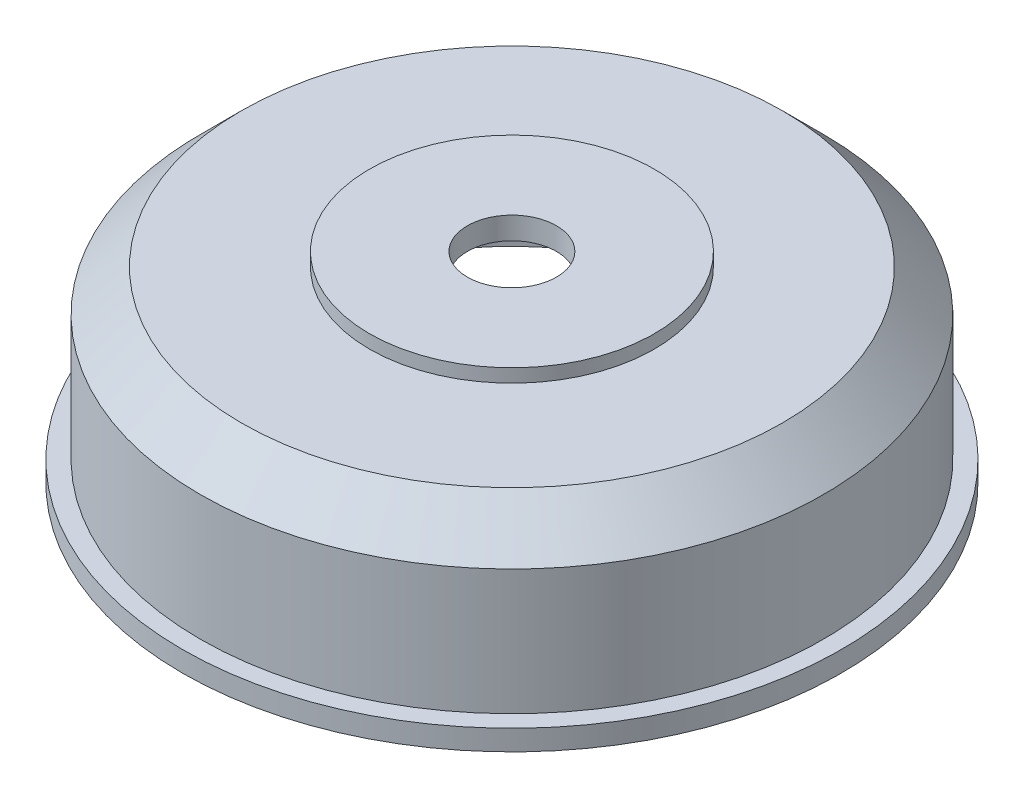
ISO-10303-21;
HEADER;
FILE_DESCRIPTION(('STEP AP214'),'2;1');
FILE_NAME('part.step','',(''),(''),'','','');
FILE_SCHEMA(('AUTOMOTIVE_DESIGN { 1 0 10303 214 1 1 1 1 }'));
ENDSEC;
DATA;
#1=APPLICATION_CONTEXT('core data for automotive mechanical design processes');
#2=APPLICATION_PROTOCOL_DEFINITION('international standard','automotive_design',2000,#1);
#3=PRODUCT_CONTEXT('',#1,'mechanical');
#4=PRODUCT('Part','Part','',(#3));
#5=PRODUCT_RELATED_PRODUCT_CATEGORY('part','',(#4));
#6=PRODUCT_DEFINITION_FORMATION('','',#4);
#7=PRODUCT_DEFINITION_CONTEXT('part definition',#1,'design');
#8=PRODUCT_DEFINITION('design','',#6,#7);
#9=PRODUCT_DEFINITION_SHAPE('','',#8);
#10=(LENGTH_UNIT() NAMED_UNIT(*) SI_UNIT(.MILLI.,.METRE.));
#11=(NAMED_UNIT(*) PLANE_ANGLE_UNIT() SI_UNIT($,.RADIAN.));
#12=(NAMED_UNIT(*) SI_UNIT($,.STERADIAN.) SOLID_ANGLE_UNIT());
#13=UNCERTAINTY_MEASURE_WITH_UNIT(LENGTH_MEASURE(1.E-05),#10,'distance_accuracy_value','');
#14=(GEOMETRIC_REPRESENTATION_CONTEXT(3) GLOBAL_UNCERTAINTY_ASSIGNED_CONTEXT((#13)) GLOBAL_UNIT_ASSIGNED_CONTEXT((#10,
#11,#12)) REPRESENTATION_CONTEXT('',''));
#15=CARTESIAN_POINT('',(0.,0.,0.));
#16=DIRECTION('',(0.,0.,1.));
#17=DIRECTION('',(1.,0.,0.));
#18=AXIS2_PLACEMENT_3D('',#15,#16,#17);
#19=CARTESIAN_POINT('',(0.,22.3659063671634,0.));
#20=DIRECTION('',(0.,-1.,0.));
#21=DIRECTION('',(0.,0.,-1.));
#22=AXIS2_PLACEMENT_3D('',#19,#20,#21);
#23=CONICAL_SURFACE('',#22,35.,0.785398163397448);
#24=CARTESIAN_POINT('',(0.,22.3659063671634,0.));
#25=DIRECTION('',(0.,1.,0.));
#26=DIRECTION('',(0.,0.,1.));
#27=AXIS2_PLACEMENT_3D('',#24,#25,#26);
#28=CIRCLE('',#27,35.);
#29=CARTESIAN_POINT('',(0.,22.3659063671634,35.));
#30=VERTEX_POINT('',#29);
#31=EDGE_CURVE('E30',#30,#30,#28,.F.);
#32=ORIENTED_EDGE('',*,*,#31,.F.);
#33=EDGE_LOOP('',(#32));
#34=FACE_BOUND('',#33,.T.);
#35=CARTESIAN_POINT('',(0.,27.0002265129365,0.));
#36=DIRECTION('',(0.,-1.,0.));
#37=DIRECTION('',(0.,0.,-1.));
#38=AXIS2_PLACEMENT_3D('',#35,#36,#37);
#39=CIRCLE('',#38,30.3656798542269);
#40=CARTESIAN_POINT('',(0.,27.0002265129365,-30.3656798542269));
#41=VERTEX_POINT('',#40);
#42=EDGE_CURVE('E18',#41,#41,#39,.T.);
#43=ORIENTED_EDGE('',*,*,#42,.T.);
#44=EDGE_LOOP('',(#43));
#45=FACE_BOUND('',#44,.T.);
#46=ADVANCED_FACE('F15',(#34,#45),#23,.T.);
#47=CARTESIAN_POINT('',(16.,27.0002265129365,0.));
#48=DIRECTION('',(0.,-1.,0.));
#49=DIRECTION('',(0.,0.,-1.));
#50=AXIS2_PLACEMENT_3D('',#47,#48,#49);
#51=PLANE('',#50);
#52=ORIENTED_EDGE('',*,*,#42,.F.);
#53=EDGE_LOOP('',(#52));
#54=FACE_BOUND('',#53,.T.);
#55=CARTESIAN_POINT('',(0.,27.0002265129364,0.));
#56=DIRECTION('',(0.,1.,0.));
#57=DIRECTION('',(0.,0.,1.));
#58=AXIS2_PLACEMENT_3D('',#55,#56,#57);
#59=CIRCLE('',#58,16.);
#60=CARTESIAN_POINT('',(0.,27.0002265129364,16.));
#61=VERTEX_POINT('',#60);
#62=EDGE_CURVE('E56',#61,#61,#59,.T.);
#63=ORIENTED_EDGE('',*,*,#62,.F.);
#64=EDGE_LOOP('',(#63));
#65=FACE_BOUND('',#64,.T.);
#66=ADVANCED_FACE('F67',(#54,#65),#51,.F.);
#67=CARTESIAN_POINT('',(0.,26.133648450844,0.));
#68=DIRECTION('',(0.,1.,0.));
#69=DIRECTION('',(0.,0.,1.));
#70=AXIS2_PLACEMENT_3D('',#67,#68,#69);
#71=CYLINDRICAL_SURFACE('',#70,35.);
#72=ORIENTED_EDGE('',*,*,#31,.T.);
#73=EDGE_LOOP('',(#72));
#74=FACE_BOUND('',#73,.T.);
#75=CARTESIAN_POINT('',(0.,8.30022651293648,0.));
#76=DIRECTION('',(0.,1.,0.));
#77=DIRECTION('',(0.,0.,1.));
#78=AXIS2_PLACEMENT_3D('',#75,#76,#77);
#79=CIRCLE('',#78,35.);
#80=CARTESIAN_POINT('',(0.,8.30022651293648,35.));
#81=VERTEX_POINT('',#80);
#82=EDGE_CURVE('E54',#81,#81,#79,.T.);
#83=ORIENTED_EDGE('',*,*,#82,.T.);
#84=EDGE_LOOP('',(#83));
#85=FACE_BOUND('',#84,.T.);
#86=ADVANCED_FACE('F70',(#74,#85),#71,.T.);
#87=CARTESIAN_POINT('',(0.,26.133648450844,0.));
#88=DIRECTION('',(0.,1.,0.));
#89=DIRECTION('',(0.,0.,1.));
#90=AXIS2_PLACEMENT_3D('',#87,#88,#89);
#91=CYLINDRICAL_SURFACE('',#90,16.);
#92=CARTESIAN_POINT('',(0.,28.5002265129364,0.));
#93=DIRECTION('',(0.,1.,0.));
#94=DIRECTION('',(0.,0.,1.));
#95=AXIS2_PLACEMENT_3D('',#92,#93,#94);
#96=CIRCLE('',#95,16.);
#97=CARTESIAN_POINT('',(0.,28.5002265129364,16.));
#98=VERTEX_POINT('',#97);
#99=EDGE_CURVE('E51',#98,#98,#96,.F.);
#100=ORIENTED_EDGE('',*,*,#99,.T.);
#101=EDGE_LOOP('',(#100));
#102=FACE_BOUND('',#101,.T.);
#103=ORIENTED_EDGE('',*,*,#62,.T.);
#104=EDGE_LOOP('',(#103));
#105=FACE_BOUND('',#104,.T.);
#106=ADVANCED_FACE('F76',(#102,#105),#91,.T.);
#107=CARTESIAN_POINT('',(37.,8.30022651293648,0.));
#108=DIRECTION('',(0.,-1.,0.));
#109=DIRECTION('',(0.,0.,-1.));
#110=AXIS2_PLACEMENT_3D('',#107,#108,#109);
#111=PLANE('',#110);
#112=CARTESIAN_POINT('',(0.,8.30022651293648,0.));
#113=DIRECTION('',(0.,1.,0.));
#114=DIRECTION('',(0.,0.,1.));
#115=AXIS2_PLACEMENT_3D('',#112,#113,#114);
#116=CIRCLE('',#115,37.);
#117=CARTESIAN_POINT('',(0.,8.30022651293648,37.));
#118=VERTEX_POINT('',#117);
#119=EDGE_CURVE('E48',#118,#118,#116,.F.);
#120=ORIENTED_EDGE('',*,*,#119,.F.);
#121=EDGE_LOOP('',(#120));
#122=FACE_BOUND('',#121,.T.);
#123=ORIENTED_EDGE('',*,*,#82,.F.);
#124=EDGE_LOOP('',(#123));
#125=FACE_BOUND('',#124,.T.);
#126=ADVANCED_FACE('F117',(#122,#125),#111,.F.);
#127=CARTESIAN_POINT('',(5.,28.5002265129364,0.));
#128=DIRECTION('',(0.,-1.,0.));
#129=DIRECTION('',(0.,0.,-1.));
#130=AXIS2_PLACEMENT_3D('',#127,#128,#129);
#131=PLANE('',#130);
#132=ORIENTED_EDGE('',*,*,#99,.F.);
#133=EDGE_LOOP('',(#132));
#134=FACE_BOUND('',#133,.T.);
#135=CARTESIAN_POINT('',(0.,28.5002265129364,0.));
#136=DIRECTION('',(0.,1.,0.));
#137=DIRECTION('',(0.,0.,1.));
#138=AXIS2_PLACEMENT_3D('',#135,#136,#137);
#139=CIRCLE('',#138,5.);
#140=CARTESIAN_POINT('',(0.,28.5002265129364,5.));
#141=VERTEX_POINT('',#140);
#142=EDGE_CURVE('E45',#141,#141,#139,.F.);
#143=ORIENTED_EDGE('',*,*,#142,.T.);
#144=EDGE_LOOP('',(#143));
#145=FACE_BOUND('',#144,.T.);
#146=ADVANCED_FACE('F113',(#134,#145),#131,.F.);
#147=CARTESIAN_POINT('',(0.,26.133648450844,0.));
#148=DIRECTION('',(0.,1.,0.));
#149=DIRECTION('',(0.,0.,1.));
#150=AXIS2_PLACEMENT_3D('',#147,#148,#149);
#151=CYLINDRICAL_SURFACE('',#150,37.);
#152=ORIENTED_EDGE('',*,*,#119,.T.);
#153=EDGE_LOOP('',(#152));
#154=FACE_BOUND('',#153,.T.);
#155=CARTESIAN_POINT('',(0.,6.00022651293648,0.));
#156=DIRECTION('',(0.,1.,0.));
#157=DIRECTION('',(0.,0.,1.));
#158=AXIS2_PLACEMENT_3D('',#155,#156,#157);
#159=CIRCLE('',#158,37.);
#160=CARTESIAN_POINT('',(0.,6.00022651293648,37.));
#161=VERTEX_POINT('',#160);
#162=EDGE_CURVE('E42',#161,#161,#159,.T.);
#163=ORIENTED_EDGE('',*,*,#162,.T.);
#164=EDGE_LOOP('',(#163));
#165=FACE_BOUND('',#164,.T.);
#166=ADVANCED_FACE('F109',(#154,#165),#151,.T.);
#167=CARTESIAN_POINT('',(0.,26.133648450844,0.));
#168=DIRECTION('',(0.,1.,0.));
#169=DIRECTION('',(0.,0.,1.));
#170=AXIS2_PLACEMENT_3D('',#167,#168,#169);
#171=CYLINDRICAL_SURFACE('',#170,5.);
#172=ORIENTED_EDGE('',*,*,#142,.F.);
#173=EDGE_LOOP('',(#172));
#174=FACE_BOUND('',#173,.T.);
#175=CARTESIAN_POINT('',(0.,26.0002265129364,0.));
#176=DIRECTION('',(0.,1.,0.));
#177=DIRECTION('',(0.,0.,1.));
#178=AXIS2_PLACEMENT_3D('',#175,#176,#177);
#179=CIRCLE('',#178,5.);
#180=CARTESIAN_POINT('',(0.,26.0002265129364,5.));
#181=VERTEX_POINT('',#180);
#182=EDGE_CURVE('E39',#181,#181,#179,.T.);
#183=ORIENTED_EDGE('',*,*,#182,.F.);
#184=EDGE_LOOP('',(#183));
#185=FACE_BOUND('',#184,.T.);
#186=ADVANCED_FACE('F105',(#174,#185),#171,.F.);
#187=CARTESIAN_POINT('',(5.,6.00022651293646,0.));
#188=DIRECTION('',(0.,1.,0.));
#189=DIRECTION('',(0.,0.,1.));
#190=AXIS2_PLACEMENT_3D('',#187,#188,#189);
#191=PLANE('',#190);
#192=ORIENTED_EDGE('',*,*,#162,.F.);
#193=EDGE_LOOP('',(#192));
#194=FACE_BOUND('',#193,.T.);
#195=CARTESIAN_POINT('',(0.,6.00022651293646,0.));
#196=DIRECTION('',(0.,1.,0.));
#197=DIRECTION('',(0.,0.,1.));
#198=AXIS2_PLACEMENT_3D('',#195,#196,#197);
#199=CIRCLE('',#198,32.5);
#200=CARTESIAN_POINT('',(0.,6.00022651293646,32.5));
#201=VERTEX_POINT('',#200);
#202=EDGE_CURVE('E36',#201,#201,#199,.T.);
#203=ORIENTED_EDGE('',*,*,#202,.T.);
#204=EDGE_LOOP('',(#203));
#205=FACE_BOUND('',#204,.T.);
#206=ADVANCED_FACE('F101',(#194,#205),#191,.F.);
#207=CARTESIAN_POINT('',(5.,26.0002265129364,0.));
#208=DIRECTION('',(0.,-1.,0.));
#209=DIRECTION('',(0.,0.,-1.));
#210=AXIS2_PLACEMENT_3D('',#207,#208,#209);
#211=PLANE('',#210);
#212=CARTESIAN_POINT('',(0.,26.0002265129364,0.));
#213=DIRECTION('',(0.,1.,0.));
#214=DIRECTION('',(0.,0.,1.));
#215=AXIS2_PLACEMENT_3D('',#212,#213,#214);
#216=CIRCLE('',#215,13.5);
#217=CARTESIAN_POINT('',(0.,26.0002265129364,13.5));
#218=VERTEX_POINT('',#217);
#219=EDGE_CURVE('E33',#218,#218,#216,.F.);
#220=ORIENTED_EDGE('',*,*,#219,.T.);
#221=EDGE_LOOP('',(#220));
#222=FACE_BOUND('',#221,.T.);
#223=ORIENTED_EDGE('',*,*,#182,.T.);
#224=EDGE_LOOP('',(#223));
#225=FACE_BOUND('',#224,.T.);
#226=ADVANCED_FACE('F97',(#222,#225),#211,.T.);
#227=CARTESIAN_POINT('',(0.,26.133648450844,0.));
#228=DIRECTION('',(0.,1.,0.));
#229=DIRECTION('',(0.,0.,1.));
#230=AXIS2_PLACEMENT_3D('',#227,#228,#229);
#231=CYLINDRICAL_SURFACE('',#230,32.5);
#232=ORIENTED_EDGE('',*,*,#202,.F.);
#233=EDGE_LOOP('',(#232));
#234=FACE_BOUND('',#233,.T.);
#235=CARTESIAN_POINT('',(0.,21.3303724612307,0.));
#236=DIRECTION('',(0.,-1.,0.));
#237=DIRECTION('',(0.,0.,-1.));
#238=AXIS2_PLACEMENT_3D('',#235,#236,#237);
#239=CIRCLE('',#238,32.5);
#240=CARTESIAN_POINT('',(0.,21.3303724612307,-32.5));
#241=VERTEX_POINT('',#240);
#242=EDGE_CURVE('E27',#241,#241,#239,.F.);
#243=ORIENTED_EDGE('',*,*,#242,.T.);
#244=EDGE_LOOP('',(#243));
#245=FACE_BOUND('',#244,.T.);
#246=ADVANCED_FACE('F93',(#234,#245),#231,.F.);
#247=CARTESIAN_POINT('',(0.,26.133648450844,0.));
#248=DIRECTION('',(0.,1.,0.));
#249=DIRECTION('',(0.,0.,1.));
#250=AXIS2_PLACEMENT_3D('',#247,#248,#249);
#251=CYLINDRICAL_SURFACE('',#250,13.5);
#252=ORIENTED_EDGE('',*,*,#219,.F.);
#253=EDGE_LOOP('',(#252));
#254=FACE_BOUND('',#253,.T.);
#255=CARTESIAN_POINT('',(0.,24.5002265129365,0.));
#256=DIRECTION('',(0.,1.,0.));
#257=DIRECTION('',(0.,0.,1.));
#258=AXIS2_PLACEMENT_3D('',#255,#256,#257);
#259=CIRCLE('',#258,13.5);
#260=CARTESIAN_POINT('',(0.,24.5002265129365,13.5));
#261=VERTEX_POINT('',#260);
#262=EDGE_CURVE('E22',#261,#261,#259,.T.);
#263=ORIENTED_EDGE('',*,*,#262,.F.);
#264=EDGE_LOOP('',(#263));
#265=FACE_BOUND('',#264,.T.);
#266=ADVANCED_FACE('F86',(#254,#265),#251,.F.);
#267=CARTESIAN_POINT('',(0.,21.3303724612307,0.));
#268=DIRECTION('',(0.,-1.,0.));
#269=DIRECTION('',(0.,0.,-1.));
#270=AXIS2_PLACEMENT_3D('',#267,#268,#269);
#271=CONICAL_SURFACE('',#270,32.5,0.785398163397448);
#272=CARTESIAN_POINT('',(0.,24.5002265129365,0.));
#273=DIRECTION('',(0.,-1.,0.));
#274=DIRECTION('',(0.,0.,-1.));
#275=AXIS2_PLACEMENT_3D('',#272,#273,#274);
#276=CIRCLE('',#275,29.3301459482942);
#277=CARTESIAN_POINT('',(0.,24.5002265129365,-29.3301459482942));
#278=VERTEX_POINT('',#277);
#279=EDGE_CURVE('E10',#278,#278,#276,.T.);
#280=ORIENTED_EDGE('',*,*,#279,.F.);
#281=EDGE_LOOP('',(#280));
#282=FACE_BOUND('',#281,.T.);
#283=ORIENTED_EDGE('',*,*,#242,.F.);
#284=EDGE_LOOP('',(#283));
#285=FACE_BOUND('',#284,.T.);
#286=ADVANCED_FACE('F81',(#282,#285),#271,.F.);
#287=CARTESIAN_POINT('',(16.,24.5002265129365,0.));
#288=DIRECTION('',(0.,-1.,0.));
#289=DIRECTION('',(0.,0.,-1.));
#290=AXIS2_PLACEMENT_3D('',#287,#288,#289);
#291=PLANE('',#290);
#292=ORIENTED_EDGE('',*,*,#279,.T.);
#293=EDGE_LOOP('',(#292));
#294=FACE_BOUND('',#293,.T.);
#295=ORIENTED_EDGE('',*,*,#262,.T.);
#296=EDGE_LOOP('',(#295));
#297=FACE_BOUND('',#296,.T.);
#298=ADVANCED_FACE('F79',(#294,#297),#291,.T.);
#299=CLOSED_SHELL('',(#46,#66,#86,#106,#126,#146,#166,#186,#206,#226,#246,#266,#286,#298));
#300=MANIFOLD_SOLID_BREP('B1',#299);
#301=ADVANCED_BREP_SHAPE_REPRESENTATION('',(#18,#300),#14);
#302=SHAPE_DEFINITION_REPRESENTATION(#9,#301);
ENDSEC;
END-ISO-10303-21;
